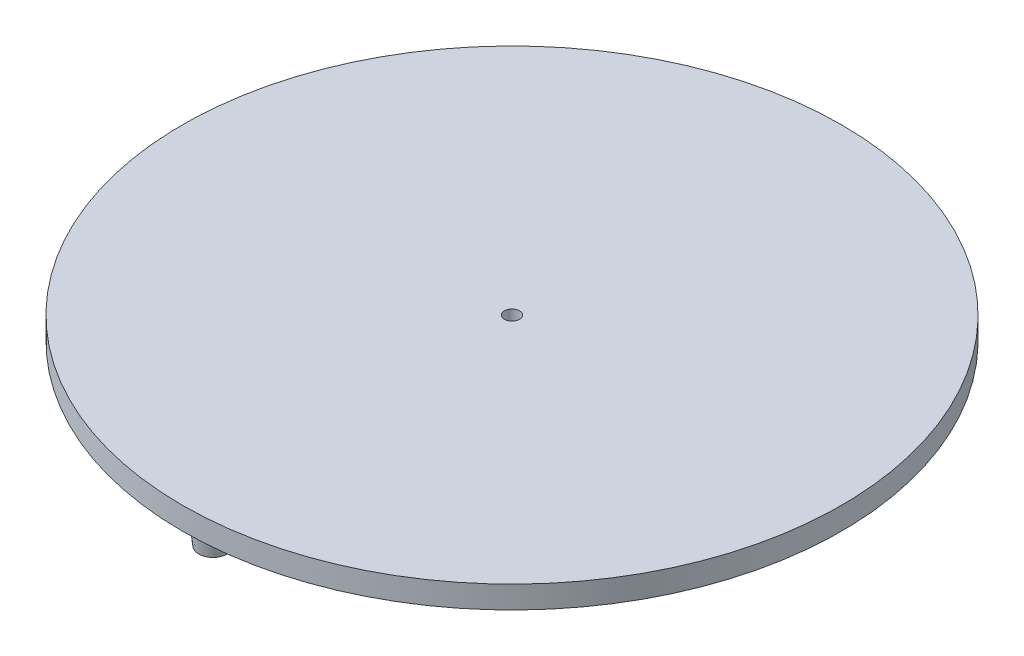
ISO-10303-21;
HEADER;
FILE_DESCRIPTION(('STEP AP214'),'2;1');
FILE_NAME('part.step','',(''),(''),'','','');
FILE_SCHEMA(('AUTOMOTIVE_DESIGN { 1 0 10303 214 1 1 1 1 }'));
ENDSEC;
DATA;
#1=APPLICATION_CONTEXT('core data for automotive mechanical design processes');
#2=APPLICATION_PROTOCOL_DEFINITION('international standard','automotive_design',2000,#1);
#3=PRODUCT_CONTEXT('',#1,'mechanical');
#4=PRODUCT('Part','Part','',(#3));
#5=PRODUCT_RELATED_PRODUCT_CATEGORY('part','',(#4));
#6=PRODUCT_DEFINITION_FORMATION('','',#4);
#7=PRODUCT_DEFINITION_CONTEXT('part definition',#1,'design');
#8=PRODUCT_DEFINITION('design','',#6,#7);
#9=PRODUCT_DEFINITION_SHAPE('','',#8);
#10=(LENGTH_UNIT() NAMED_UNIT(*) SI_UNIT(.MILLI.,.METRE.));
#11=(NAMED_UNIT(*) PLANE_ANGLE_UNIT() SI_UNIT($,.RADIAN.));
#12=(NAMED_UNIT(*) SI_UNIT($,.STERADIAN.) SOLID_ANGLE_UNIT());
#13=UNCERTAINTY_MEASURE_WITH_UNIT(LENGTH_MEASURE(1.E-05),#10,'distance_accuracy_value','');
#14=(GEOMETRIC_REPRESENTATION_CONTEXT(3) GLOBAL_UNCERTAINTY_ASSIGNED_CONTEXT((#13)) GLOBAL_UNIT_ASSIGNED_CONTEXT((#10,
#11,#12)) REPRESENTATION_CONTEXT('',''));
#15=CARTESIAN_POINT('',(0.,0.,0.));
#16=DIRECTION('',(0.,0.,1.));
#17=DIRECTION('',(1.,0.,0.));
#18=AXIS2_PLACEMENT_3D('',#15,#16,#17);
#19=CARTESIAN_POINT('',(0.,19.05,0.));
#20=DIRECTION('',(0.,-1.,0.));
#21=DIRECTION('',(0.,0.,-1.));
#22=AXIS2_PLACEMENT_3D('',#19,#20,#21);
#23=CYLINDRICAL_SURFACE('',#22,279.945595429);
#24=CARTESIAN_POINT('',(0.,19.05,0.));
#25=DIRECTION('',(0.,1.,0.));
#26=DIRECTION('',(0.,0.,1.));
#27=AXIS2_PLACEMENT_3D('',#24,#25,#26);
#28=CIRCLE('',#27,279.945595429);
#29=CARTESIAN_POINT('',(0.,19.05,-279.945595429));
#30=VERTEX_POINT('',#29);
#31=EDGE_CURVE('E11',#30,#30,#28,.T.);
#32=CARTESIAN_POINT('',(0.,0.,0.));
#33=DIRECTION('',(0.,1.,0.));
#34=DIRECTION('',(0.,0.,1.));
#35=AXIS2_PLACEMENT_3D('',#32,#33,#34);
#36=CIRCLE('',#35,279.945595429);
#37=CARTESIAN_POINT('',(0.,0.,-279.945595429));
#38=VERTEX_POINT('',#37);
#39=EDGE_CURVE('E79',#38,#38,#36,.T.);
#40=CARTESIAN_POINT('',(0.,19.05,-279.945595429));
#41=CARTESIAN_POINT('',(0.,18.8515625,-279.945595429));
#42=CARTESIAN_POINT('',(0.,18.653125,-279.945595429));
#43=CARTESIAN_POINT('',(0.,18.25625,-279.945595429));
#44=CARTESIAN_POINT('',(0.,18.0578125,-279.945595429));
#45=CARTESIAN_POINT('',(0.,17.6609375,-279.945595429));
#46=CARTESIAN_POINT('',(0.,17.4625,-279.945595429));
#47=CARTESIAN_POINT('',(0.,17.065625,-279.945595429));
#48=CARTESIAN_POINT('',(0.,16.8671875,-279.945595429));
#49=CARTESIAN_POINT('',(0.,16.4703125,-279.945595429));
#50=CARTESIAN_POINT('',(0.,16.271875,-279.945595429));
#51=CARTESIAN_POINT('',(0.,15.875,-279.945595429));
#52=CARTESIAN_POINT('',(0.,15.6765625,-279.945595429));
#53=CARTESIAN_POINT('',(0.,15.2796875,-279.945595429));
#54=CARTESIAN_POINT('',(0.,15.08125,-279.945595429));
#55=CARTESIAN_POINT('',(0.,14.684375,-279.945595429));
#56=CARTESIAN_POINT('',(0.,14.4859375,-279.945595429));
#57=CARTESIAN_POINT('',(0.,14.0890625,-279.945595429));
#58=CARTESIAN_POINT('',(0.,13.890625,-279.945595429));
#59=CARTESIAN_POINT('',(0.,13.49375,-279.945595429));
#60=CARTESIAN_POINT('',(0.,13.2953125,-279.945595429));
#61=CARTESIAN_POINT('',(0.,12.8984375,-279.945595429));
#62=CARTESIAN_POINT('',(0.,12.7,-279.945595429));
#63=CARTESIAN_POINT('',(0.,12.303125,-279.945595429));
#64=CARTESIAN_POINT('',(0.,12.1046875,-279.945595429));
#65=CARTESIAN_POINT('',(0.,11.7078125,-279.945595429));
#66=CARTESIAN_POINT('',(0.,11.509375,-279.945595429));
#67=CARTESIAN_POINT('',(0.,11.1125,-279.945595429));
#68=CARTESIAN_POINT('',(0.,10.9140625,-279.945595429));
#69=CARTESIAN_POINT('',(0.,10.5171875,-279.945595429));
#70=CARTESIAN_POINT('',(0.,10.31875,-279.945595429));
#71=CARTESIAN_POINT('',(0.,9.921875,-279.945595429));
#72=CARTESIAN_POINT('',(0.,9.7234375,-279.945595429));
#73=CARTESIAN_POINT('',(0.,9.3265625,-279.945595429));
#74=CARTESIAN_POINT('',(0.,9.128125,-279.945595429));
#75=CARTESIAN_POINT('',(0.,8.73125,-279.945595429));
#76=CARTESIAN_POINT('',(0.,8.5328125,-279.945595429));
#77=CARTESIAN_POINT('',(0.,8.1359375,-279.945595429));
#78=CARTESIAN_POINT('',(0.,7.9375,-279.945595429));
#79=CARTESIAN_POINT('',(0.,7.540625,-279.945595429));
#80=CARTESIAN_POINT('',(0.,7.3421875,-279.945595429));
#81=CARTESIAN_POINT('',(0.,6.9453125,-279.945595429));
#82=CARTESIAN_POINT('',(0.,6.746875,-279.945595429));
#83=CARTESIAN_POINT('',(0.,6.35,-279.945595429));
#84=CARTESIAN_POINT('',(0.,6.1515625,-279.945595429));
#85=CARTESIAN_POINT('',(0.,5.7546875,-279.945595429));
#86=CARTESIAN_POINT('',(0.,5.55625,-279.945595429));
#87=CARTESIAN_POINT('',(0.,5.159375,-279.945595429));
#88=CARTESIAN_POINT('',(0.,4.9609375,-279.945595429));
#89=CARTESIAN_POINT('',(0.,4.5640625,-279.945595429));
#90=CARTESIAN_POINT('',(0.,4.365625,-279.945595429));
#91=CARTESIAN_POINT('',(0.,3.96875,-279.945595429));
#92=CARTESIAN_POINT('',(0.,3.7703125,-279.945595429));
#93=CARTESIAN_POINT('',(0.,3.3734375,-279.945595429));
#94=CARTESIAN_POINT('',(0.,3.175,-279.945595429));
#95=CARTESIAN_POINT('',(0.,2.778125,-279.945595429));
#96=CARTESIAN_POINT('',(0.,2.5796875,-279.945595429));
#97=CARTESIAN_POINT('',(0.,2.1828125,-279.945595429));
#98=CARTESIAN_POINT('',(0.,1.984375,-279.945595429));
#99=CARTESIAN_POINT('',(0.,1.5875,-279.945595429));
#100=CARTESIAN_POINT('',(0.,1.3890625,-279.945595429));
#101=CARTESIAN_POINT('',(0.,0.992187500000001,-279.945595429));
#102=CARTESIAN_POINT('',(0.,0.793750000000001,-279.945595429));
#103=CARTESIAN_POINT('',(0.,0.396875,-279.945595429));
#104=CARTESIAN_POINT('',(0.,0.1984375,-279.945595429));
#105=CARTESIAN_POINT('',(0.,0.,-279.945595429));
#106=B_SPLINE_CURVE_WITH_KNOTS('',3,(#40,#41,#42,#43,#44,#45,#46,#47,#48,#49,#50,#51,#52,#53,
#54,#55,#56,#57,#58,#59,#60,#61,#62,#63,#64,#65,#66,#67,#68,#69,#70,#71,#72,#73,#74,#75,#76,#77,
#78,#79,#80,#81,#82,#83,#84,#85,#86,#87,#88,#89,#90,#91,#92,#93,#94,#95,#96,#97,#98,#99,#100,
#101,#102,#103,#104,#105),.UNSPECIFIED.,.F.,.F.,(4,2,2,2,2,2,2,2,2,2,2,2,2,2,2,2,2,2,2,2,2,2,2,
2,2,2,2,2,2,2,2,2,4),(0.,0.5953125,1.190625,1.7859375,2.38125,2.9765625,3.571875,4.1671875,
4.7625,5.3578125,5.953125,6.5484375,7.14375,7.7390625,8.334375,8.9296875,9.525,10.1203125,
10.715625,11.3109375,11.90625,12.5015625,13.096875,13.6921875,14.2875,14.8828125,15.478125,
16.0734375,16.66875,17.2640625,17.859375,18.4546875,19.05),.UNSPECIFIED.);
#107=EDGE_CURVE('BSEAM68',#30,#38,#106,.T.);
#108=ORIENTED_EDGE('',*,*,#31,.F.);
#109=ORIENTED_EDGE('',*,*,#39,.T.);
#110=ORIENTED_EDGE('',*,*,#107,.T.);
#111=ORIENTED_EDGE('',*,*,#107,.F.);
#112=EDGE_LOOP('',(#108,#110,#109,#111));
#113=FACE_BOUND('',#112,.T.);
#114=ADVANCED_FACE('F68',(#113),#23,.T.);
#115=CARTESIAN_POINT('',(0.,19.05,0.));
#116=DIRECTION('',(0.,1.,0.));
#117=DIRECTION('',(0.,0.,1.));
#118=AXIS2_PLACEMENT_3D('',#115,#116,#117);
#119=PLANE('',#118);
#120=CARTESIAN_POINT('',(0.,19.05,0.));
#121=DIRECTION('',(0.,1.,0.));
#122=DIRECTION('',(0.,0.,1.));
#123=AXIS2_PLACEMENT_3D('',#120,#121,#122);
#124=CIRCLE('',#123,6.35);
#125=CARTESIAN_POINT('',(0.,19.05,6.35));
#126=VERTEX_POINT('',#125);
#127=EDGE_CURVE('E88',#126,#126,#124,.T.);
#128=ORIENTED_EDGE('',*,*,#127,.F.);
#129=EDGE_LOOP('',(#128));
#130=FACE_BOUND('',#129,.T.);
#131=ORIENTED_EDGE('',*,*,#31,.T.);
#132=EDGE_LOOP('',(#131));
#133=FACE_BOUND('',#132,.T.);
#134=ADVANCED_FACE('F120',(#130,#133),#119,.T.);
#135=CARTESIAN_POINT('',(0.,0.,0.));
#136=DIRECTION('',(0.,1.,0.));
#137=DIRECTION('',(0.,0.,1.));
#138=AXIS2_PLACEMENT_3D('',#135,#136,#137);
#139=PLANE('',#138);
#140=CARTESIAN_POINT('',(-219.970452561249,0.,-126.999999999998));
#141=DIRECTION('',(0.,-1.,0.));
#142=DIRECTION('',(0.,0.,-1.));
#143=AXIS2_PLACEMENT_3D('',#140,#141,#142);
#144=CIRCLE('',#143,14.225);
#145=CARTESIAN_POINT('',(-219.970452561249,0.,-141.224999999998));
#146=VERTEX_POINT('',#145);
#147=EDGE_CURVE('E207',#146,#146,#144,.T.);
#148=ORIENTED_EDGE('',*,*,#147,.F.);
#149=EDGE_LOOP('',(#148));
#150=FACE_BOUND('',#149,.T.);
#151=CARTESIAN_POINT('',(219.970452561247,0.,-127.000000000001));
#152=DIRECTION('',(0.,-1.,0.));
#153=DIRECTION('',(0.,0.,-1.));
#154=AXIS2_PLACEMENT_3D('',#151,#152,#153);
#155=CIRCLE('',#154,14.225);
#156=CARTESIAN_POINT('',(219.970452561247,0.,-141.225000000001));
#157=VERTEX_POINT('',#156);
#158=EDGE_CURVE('E255',#157,#157,#155,.T.);
#159=ORIENTED_EDGE('',*,*,#158,.F.);
#160=EDGE_LOOP('',(#159));
#161=FACE_BOUND('',#160,.T.);
#162=CARTESIAN_POINT('',(14.1957535473107,0.,253.088294880997));
#163=CARTESIAN_POINT('',(14.1701984288474,0.,252.69032014969));
#164=CARTESIAN_POINT('',(14.1282108687022,0.,252.293449179886));
#165=CARTESIAN_POINT('',(14.0111655203681,0.,251.504486149537));
#166=CARTESIAN_POINT('',(13.9361007012605,0.,251.112395123238));
#167=CARTESIAN_POINT('',(13.7530641359136,0.,250.335636393652));
#168=CARTESIAN_POINT('',(13.64506571301,0.,249.950974978035));
#169=CARTESIAN_POINT('',(13.3968470480072,0.,249.192209699102));
#170=CARTESIAN_POINT('',(13.2566283591753,0.,248.818105327831));
#171=CARTESIAN_POINT('',(12.9450238920503,0.,248.083222366163));
#172=CARTESIAN_POINT('',(12.7736458744879,0.,247.722440484446));
#173=CARTESIAN_POINT('',(12.4010127280601,0.,247.016646773546));
#174=CARTESIAN_POINT('',(12.199757088719,0.,246.67163521394));
#175=CARTESIAN_POINT('',(11.7689167748453,0.,245.999769622604));
#176=CARTESIAN_POINT('',(11.5393312927843,0.,245.672916108846));
#177=CARTESIAN_POINT('',(11.053570361634,0.,245.039608469317));
#178=CARTESIAN_POINT('',(10.7973949020217,0.,244.733154351619));
#179=CARTESIAN_POINT('',(10.2601852904625,0.,244.142566598594));
#180=CARTESIAN_POINT('',(9.97913765783475,0.,243.858445227049));
#181=CARTESIAN_POINT('',(9.39430449709158,0.,243.314657207116));
#182=CARTESIAN_POINT('',(9.09051895078833,0.,243.054990578289));
#183=CARTESIAN_POINT('',(8.46234491718254,0.,242.561949763203));
#184=CARTESIAN_POINT('',(8.13795786151846,0.,242.328573753078));
#185=CARTESIAN_POINT('',(7.47079218439578,0.,241.889786180899));
#186=CARTESIAN_POINT('',(7.12801366421285,0.,241.684374464877));
#187=CARTESIAN_POINT('',(6.42361584271373,0.,241.301541003989));
#188=CARTESIAN_POINT('',(6.06186818895044,0.,241.124355305387));
#189=CARTESIAN_POINT('',(5.3246131376312,0.,240.801372266642));
#190=CARTESIAN_POINT('',(4.94910558413116,0.,240.655575282363));
#191=CARTESIAN_POINT('',(4.18702989600398,0.,240.396556873866));
#192=CARTESIAN_POINT('',(3.80046211416906,0.,240.283334411877));
#193=CARTESIAN_POINT('',(3.01907021512381,0.,240.090359506911));
#194=CARTESIAN_POINT('',(2.62424640108217,0.,240.010605837187));
#195=CARTESIAN_POINT('',(1.83392127625669,0.,239.885849196171));
#196=CARTESIAN_POINT('',(1.43848242546301,0.,239.840448951355));
#197=CARTESIAN_POINT('',(0.645130012448755,0.,239.783009581897));
#198=CARTESIAN_POINT('',(0.247216352177549,0.,239.770971787605));
#199=CARTESIAN_POINT('',(-0.349291218450164,0.,239.777726350679));
#200=CARTESIAN_POINT('',(-0.54809998685375,0.,239.784116242565));
#201=CARTESIAN_POINT('',(-0.945286427834851,0.,239.805070325903));
#202=CARTESIAN_POINT('',(-1.14366409955519,0.,239.819634533593));
#203=CARTESIAN_POINT('',(-1.73761890471403,0.,239.87562433426));
#204=CARTESIAN_POINT('',(-2.13211040367793,0.,239.929348153872));
#205=CARTESIAN_POINT('',(-2.91944417468338,0.,240.070421685702));
#206=CARTESIAN_POINT('',(-3.31222144347612,0.,240.158132034514));
#207=CARTESIAN_POINT('',(-4.08888303565812,0.,240.366722542631));
#208=CARTESIAN_POINT('',(-4.47276737834824,0.,240.487602629939));
#209=CARTESIAN_POINT('',(-5.22870733822446,0.,240.761683855311));
#210=CARTESIAN_POINT('',(-5.60076587700726,0.,240.914876937814));
#211=CARTESIAN_POINT('',(-6.33046170708994,0.,241.252440065897));
#212=CARTESIAN_POINT('',(-6.68809893222865,0.,241.436810254489));
#213=CARTESIAN_POINT('',(-7.38233581365691,0.,241.832959270787));
#214=CARTESIAN_POINT('',(-7.71913188451525,0.,242.044394098169));
#215=CARTESIAN_POINT('',(-8.37384784549451,0.,242.49469669585));
#216=CARTESIAN_POINT('',(-8.69176793420417,0.,242.73356417746));
#217=CARTESIAN_POINT('',(-9.30667989876059,0.,243.237037849946));
#218=CARTESIAN_POINT('',(-9.60366563926392,0.,243.501651532763));
#219=CARTESIAN_POINT('',(-10.1746051113361,0.,244.054659725459));
#220=CARTESIAN_POINT('',(-10.4485586113721,0.,244.343054474343));
#221=CARTESIAN_POINT('',(-10.9740658262415,0.,244.944480371347));
#222=CARTESIAN_POINT('',(-11.2253796511023,0.,245.257721177234));
#223=CARTESIAN_POINT('',(-11.7008189327973,0.,245.90420036059));
#224=CARTESIAN_POINT('',(-11.9249443127452,0.,246.237438794606));
#225=CARTESIAN_POINT('',(-12.3442849556832,0.,246.92151214586));
#226=CARTESIAN_POINT('',(-12.5395081656094,0.,247.272342190461));
#227=CARTESIAN_POINT('',(-12.8996109690582,0.,247.989247967696));
#228=CARTESIAN_POINT('',(-13.0644905856622,0.,248.355323688733));
#229=CARTESIAN_POINT('',(-13.3626376356565,0.,249.100263990521));
#230=CARTESIAN_POINT('',(-13.4958953762573,0.,249.479132451978));
#231=CARTESIAN_POINT('',(-13.7296610518645,0.,250.246839586769));
#232=CARTESIAN_POINT('',(-13.8301692739105,0.,250.635678172684));
#233=CARTESIAN_POINT('',(-13.9976876450379,0.,251.42059988889));
#234=CARTESIAN_POINT('',(-14.0646902124476,0.,251.816684637845));
#235=CARTESIAN_POINT('',(-14.1647653564846,0.,252.613106056329));
#236=CARTESIAN_POINT('',(-14.1978375649059,0.,253.013442771953));
#237=CARTESIAN_POINT('',(-14.2298872687194,0.,253.811517386029));
#238=CARTESIAN_POINT('',(-14.2292011184116,0.,254.209241446331));
#239=CARTESIAN_POINT('',(-14.2036041117617,0.,254.804670820507));
#240=CARTESIAN_POINT('',(-14.1909744719727,0.,255.002975710558));
#241=CARTESIAN_POINT('',(-14.1575622461974,0.,255.398896622413));
#242=CARTESIAN_POINT('',(-14.1367795160422,0.,255.596512631974));
#243=CARTESIAN_POINT('',(-14.0621226448776,0.,256.187766776277));
#244=CARTESIAN_POINT('',(-13.9959337983078,0.,256.579952808046));
#245=CARTESIAN_POINT('',(-13.8721825800341,0.,257.1628503049));
#246=CARTESIAN_POINT('',(-13.8268525449697,0.,257.356257970723));
#247=CARTESIAN_POINT('',(-13.7280780188843,0.,257.741047887677));
#248=CARTESIAN_POINT('',(-13.6746314276547,0.,257.932429600832));
#249=CARTESIAN_POINT('',(-13.5008856686508,0.,258.507402234307));
#250=CARTESIAN_POINT('',(-13.3681353068383,0.,258.887310467469));
#251=CARTESIAN_POINT('',(-13.0706869141436,0.,259.634357344851));
#252=CARTESIAN_POINT('',(-12.9059882086268,0.,260.001495719224));
#253=CARTESIAN_POINT('',(-12.5458946917486,0.,260.72043105385));
#254=CARTESIAN_POINT('',(-12.3504984061437,0.,261.072227276263));
#255=CARTESIAN_POINT('',(-11.93055407202,0.,261.757953187321));
#256=CARTESIAN_POINT('',(-11.7060063955882,0.,262.091883103935));
#257=CARTESIAN_POINT('',(-11.2321062892185,0.,262.736009124996));
#258=CARTESIAN_POINT('',(-10.9830529698637,0.,263.046425392992));
#259=CARTESIAN_POINT('',(-10.4598385016364,0.,263.645554053867));
#260=CARTESIAN_POINT('',(-10.1856667112733,0.,263.934257152721));
#261=CARTESIAN_POINT('',(-9.61422174113692,0.,264.487887795126));
#262=CARTESIAN_POINT('',(-9.316945718994,0.,264.752812404689));
#263=CARTESIAN_POINT('',(-8.70152159980922,0.,265.256902827729));
#264=CARTESIAN_POINT('',(-8.38338273145313,0.,265.496079908592));
#265=CARTESIAN_POINT('',(-7.72435586822739,0.,265.94981139845));
#266=CARTESIAN_POINT('',(-7.38324087626948,0.,266.16403625624));
#267=CARTESIAN_POINT('',(-6.68411224766656,0.,266.562874204898));
#268=CARTESIAN_POINT('',(-6.32609850594502,0.,266.747487111607));
#269=CARTESIAN_POINT('',(-5.59577675381521,0.,267.085603337007));
#270=CARTESIAN_POINT('',(-5.22347241117856,0.,267.239114575468));
#271=CARTESIAN_POINT('',(-4.46713410431456,0.,267.513844900525));
#272=CARTESIAN_POINT('',(-4.08310026684144,0.,267.635064335944));
#273=CARTESIAN_POINT('',(-3.3090094639382,0.,267.843452398562));
#274=CARTESIAN_POINT('',(-2.9190197450461,0.,267.930870875196));
#275=CARTESIAN_POINT('',(-2.13304130739261,0.,268.072320795742));
#276=CARTESIAN_POINT('',(-1.73705271433103,0.,268.12635293824));
#277=CARTESIAN_POINT('',(-0.941810124613052,0.,268.200788460301));
#278=CARTESIAN_POINT('',(-0.542555158229486,0.,268.221181459833));
#279=CARTESIAN_POINT('',(0.256263702146352,0.,268.228509781742));
#280=CARTESIAN_POINT('',(0.655827608704899,0.,268.215443662889));
#281=CARTESIAN_POINT('',(1.4529246839055,0.,268.156323749124));
#282=CARTESIAN_POINT('',(1.85045533553452,0.,268.110235973957));
#283=CARTESIAN_POINT('',(2.64022766168315,0.,267.984814645269));
#284=CARTESIAN_POINT('',(3.03246965693371,0.,267.905483117264));
#285=CARTESIAN_POINT('',(3.80870589791642,0.,267.713922992138));
#286=CARTESIAN_POINT('',(4.19270276439268,0.,267.601705019335));
#287=CARTESIAN_POINT('',(4.94979011535204,0.,267.345062671961));
#288=CARTESIAN_POINT('',(5.32288035634737,0.,267.200637578994));
#289=CARTESIAN_POINT('',(6.05502469267624,0.,266.880837512831));
#290=CARTESIAN_POINT('',(6.41409482140605,0.,266.705499238367));
#291=CARTESIAN_POINT('',(7.11613030196536,0.,266.325108798715));
#292=CARTESIAN_POINT('',(7.45909567836101,0.,266.120056678855));
#293=CARTESIAN_POINT('',(8.12662546442288,0.,265.6817686154));
#294=CARTESIAN_POINT('',(8.45118566626105,0.,265.44852626476));
#295=CARTESIAN_POINT('',(9.07960627430473,0.,264.955651908386));
#296=CARTESIAN_POINT('',(9.38346659272219,0.,264.696019790746));
#297=CARTESIAN_POINT('',(9.96849011327641,0.,264.152197748035));
#298=CARTESIAN_POINT('',(10.249647725707,0.,263.868001810472));
#299=CARTESIAN_POINT('',(10.7872552863863,0.,263.277118123827));
#300=CARTESIAN_POINT('',(11.0437046620916,0.,262.970429853838));
#301=CARTESIAN_POINT('',(11.5301232662198,0.,262.336643890258));
#302=CARTESIAN_POINT('',(11.7600880582045,0.,262.009542791417));
#303=CARTESIAN_POINT('',(12.1918083210514,0.,261.337229609491));
#304=CARTESIAN_POINT('',(12.3935641307733,0.,260.99201774403));
#305=CARTESIAN_POINT('',(12.768817431463,0.,260.283058718325));
#306=CARTESIAN_POINT('',(12.9420791782698,0.,259.919186710592));
#307=CARTESIAN_POINT('',(13.2570079972181,0.,259.178027889109));
#308=CARTESIAN_POINT('',(13.3986759316686,0.,258.800741441814));
#309=CARTESIAN_POINT('',(13.6491290442035,0.,258.035883015048));
#310=CARTESIAN_POINT('',(13.7579521842066,0.,257.648323477403));
#311=CARTESIAN_POINT('',(13.9420590511496,0.,256.865453810749));
#312=CARTESIAN_POINT('',(14.0173518306857,0.,256.470145803815));
#313=CARTESIAN_POINT('',(14.1479273763221,0.,255.579004153764));
#314=CARTESIAN_POINT('',(14.1940751043002,0.,255.081807380599));
#315=CARTESIAN_POINT('',(14.233969510406,0.,254.085263702902));
#316=CARTESIAN_POINT('',(14.2277072797338,0.,253.585916447245));
#317=CARTESIAN_POINT('',(14.1957535473107,0.,253.088294880997));
#318=B_SPLINE_CURVE_WITH_KNOTS('',3,(#162,#163,#164,#165,#166,#167,#168,#169,#170,#171,#172,
#173,#174,#175,#176,#177,#178,#179,#180,#181,#182,#183,#184,#185,#186,#187,#188,#189,#190,#191,
#192,#193,#194,#195,#196,#197,#198,#199,#200,#201,#202,#203,#204,#205,#206,#207,#208,#209,#210,
#211,#212,#213,#214,#215,#216,#217,#218,#219,#220,#221,#222,#223,#224,#225,#226,#227,#228,#229,
#230,#231,#232,#233,#234,#235,#236,#237,#238,#239,#240,#241,#242,#243,#244,#245,#246,#247,#248,
#249,#250,#251,#252,#253,#254,#255,#256,#257,#258,#259,#260,#261,#262,#263,#264,#265,#266,#267,
#268,#269,#270,#271,#272,#273,#274,#275,#276,#277,#278,#279,#280,#281,#282,#283,#284,#285,#286,
#287,#288,#289,#290,#291,#292,#293,#294,#295,#296,#297,#298,#299,#300,#301,#302,#303,#304,#305,
#306,#307,#308,#309,#310,#311,#312,#313,#314,#315,#316,#317),.UNSPECIFIED.,.T.,.F.,(4,2,2,2,2,2,
2,2,2,2,2,2,2,2,2,2,2,2,2,2,2,2,2,2,2,2,2,2,2,2,2,2,2,2,2,2,2,2,2,2,2,2,2,2,2,2,2,2,2,2,2,2,2,2,
2,2,2,2,2,2,2,2,2,2,2,2,2,2,2,2,2,2,2,2,2,2,2,4),(0.,1.19594747775145,2.39214928941269,
3.5893226261229,4.78643826187266,5.98325614419806,7.18009447717769,8.37696693333595,
9.57383986315832,10.7713655164573,11.9688921276529,13.1663356112893,14.3637725016794,
15.5707498331895,16.7777408478839,17.9846934055668,19.1916017204647,20.3843301912832,
21.5771062222822,22.1736948982859,22.7702847594458,23.9631875913309,25.1691113429508,
26.3750324770358,27.5806533320691,28.7862797175431,29.9778732386086,31.1694542210426,
32.3613829869982,33.5533237334526,34.7566900645,35.9600597984683,37.1630980370947,
38.3661353606088,39.5695409661496,40.7729360239247,41.976603263296,43.1802835645091,
44.371973346072,44.9679461584605,45.5639295097456,46.7554717399176,47.3512767538425,
47.9472361994797,49.1529404500124,50.3586701634718,51.5644577995,52.7702300464182,
53.9627757761049,55.1558290873082,56.3490294054683,57.5417054257465,58.748679323332,
59.9556607268771,61.1623343957482,62.3689950293691,63.5665575219771,64.7640949555955,
65.9620018442941,67.1599603329079,68.3591533297513,69.5582732713418,70.7570062506903,
71.9557659710567,73.1531120447117,74.3504562918791,75.5480731837586,76.7456951544065,
77.9436111019527,79.1415548011403,80.3396988771599,81.5378285592726,82.7454201076858,
83.9529786925345,85.159136192278,86.3649678534102,87.8601082819939,89.355502864139),.UNSPECIFIED.);
#319=CARTESIAN_POINT('',(-14.1957535473107,0.,254.911705119003));
#320=VERTEX_POINT('',#319);
#321=EDGE_CURVE('E70',#320,#320,#318,.F.);
#322=ORIENTED_EDGE('',*,*,#321,.F.);
#323=EDGE_LOOP('',(#322));
#324=FACE_BOUND('',#323,.T.);
#325=CARTESIAN_POINT('',(0.,0.,0.));
#326=DIRECTION('',(0.,1.,0.));
#327=DIRECTION('',(0.,0.,1.));
#328=AXIS2_PLACEMENT_3D('',#325,#326,#327);
#329=CIRCLE('',#328,6.35);
#330=CARTESIAN_POINT('',(0.,0.,6.35));
#331=VERTEX_POINT('',#330);
#332=EDGE_CURVE('E84',#331,#331,#329,.F.);
#333=ORIENTED_EDGE('',*,*,#332,.F.);
#334=EDGE_LOOP('',(#333));
#335=FACE_BOUND('',#334,.T.);
#336=ORIENTED_EDGE('',*,*,#39,.F.);
#337=EDGE_LOOP('',(#336));
#338=FACE_BOUND('',#337,.T.);
#339=ADVANCED_FACE('F119',(#150,#161,#324,#335,#338),#139,.F.);
#340=CARTESIAN_POINT('',(0.,-0.001000000000001,0.));
#341=DIRECTION('',(0.,1.,0.));
#342=DIRECTION('',(0.,0.,1.));
#343=AXIS2_PLACEMENT_3D('',#340,#341,#342);
#344=CYLINDRICAL_SURFACE('',#343,6.35);
#345=ORIENTED_EDGE('',*,*,#127,.T.);
#346=EDGE_LOOP('',(#345));
#347=FACE_BOUND('',#346,.T.);
#348=ORIENTED_EDGE('',*,*,#332,.T.);
#349=EDGE_LOOP('',(#348));
#350=FACE_BOUND('',#349,.T.);
#351=ADVANCED_FACE('F108',(#347,#350),#344,.F.);
#352=CARTESIAN_POINT('',(0.,-23.749999998,254.));
#353=DIRECTION('',(0.,-1.,0.));
#354=DIRECTION('',(0.,0.,-1.));
#355=AXIS2_PLACEMENT_3D('',#352,#353,#354);
#356=PLANE('',#355);
#357=CARTESIAN_POINT('',(0.,-23.749999998,254.));
#358=DIRECTION('',(0.,-1.,0.));
#359=DIRECTION('',(0.,0.,-1.));
#360=AXIS2_PLACEMENT_3D('',#357,#358,#359);
#361=CIRCLE('',#360,12.075);
#362=CARTESIAN_POINT('',(-12.0303234025491,-23.749999998,255.037759042399));
#363=VERTEX_POINT('',#362);
#364=EDGE_CURVE('E90',#363,#363,#361,.T.);
#365=ORIENTED_EDGE('',*,*,#364,.T.);
#366=EDGE_LOOP('',(#365));
#367=FACE_BOUND('',#366,.T.);
#368=ADVANCED_FACE('F97',(#367),#356,.T.);
#369=CARTESIAN_POINT('',(-14.1957535473107,0.,254.911705119003));
#370=CARTESIAN_POINT('',(-14.1957535473107,-7.94961548482026,254.911705119003));
#371=CARTESIAN_POINT('',(-13.1130384749299,-15.8498077414101,254.974732080701));
#372=CARTESIAN_POINT('',(-12.0303234025491,-23.749999998,255.037759042399));
#373=CARTESIAN_POINT('',(-14.2209127343008,0.,254.519962646006));
#374=CARTESIAN_POINT('',(-14.2209127343008,-7.94961548482026,254.519962646006));
#375=CARTESIAN_POINT('',(-13.1399369382295,-15.8498077414101,254.6128679427));
#376=CARTESIAN_POINT('',(-12.0589611421582,-23.749999998,254.705773239394));
#377=CARTESIAN_POINT('',(-14.238953276041,0.,253.74180481998));
#378=CARTESIAN_POINT('',(-14.238953276041,-7.94961830068837,253.74180481998));
#379=CARTESIAN_POINT('',(-13.1638490539977,-15.8498091493442,253.893763487851));
#380=CARTESIAN_POINT('',(-12.0887448319545,-23.749999998,254.045722155722));
#381=CARTESIAN_POINT('',(-14.1726104167038,0.,252.594450054141));
#382=CARTESIAN_POINT('',(-14.1726104167038,-7.94962420106348,252.594450054141));
#383=CARTESIAN_POINT('',(-13.1131967993869,-15.8498120995317,252.832615607808));
#384=CARTESIAN_POINT('',(-12.0537831820699,-23.749999998,253.070781161474));
#385=CARTESIAN_POINT('',(-14.0162937101912,0.,251.470877874802));
#386=CARTESIAN_POINT('',(-14.0162937101912,-7.94962837982032,251.470877874802));
#387=CARTESIAN_POINT('',(-12.9791581207426,-15.8498141889102,251.79261386877));
#388=CARTESIAN_POINT('',(-11.9420225312939,-23.749999998,252.114349862738));
#389=CARTESIAN_POINT('',(-12.5591293366966,0.,244.895543997572));
#390=CARTESIAN_POINT('',(-12.5591293366966,-7.94962721536289,244.895543997573));
#391=CARTESIAN_POINT('',(-11.6934115300551,-15.8498136066814,245.701304313228));
#392=CARTESIAN_POINT('',(-10.8276937234136,-23.749999998,246.507064628884));
#393=CARTESIAN_POINT('',(-7.17958468694651,0.,240.20679344453));
#394=CARTESIAN_POINT('',(-7.17958468694651,-7.94961860257245,240.20679344453));
#395=CARTESIAN_POINT('',(-6.76455828871114,-15.8498093002862,241.317336937864));
#396=CARTESIAN_POINT('',(-6.34953189047577,-23.749999998,242.427880431198));
#397=CARTESIAN_POINT('',(6.92314434092724,0.,239.301062712888));
#398=CARTESIAN_POINT('',(6.92314434092724,-7.94961158763001,239.301062712888));
#399=CARTESIAN_POINT('',(6.2625506793121,-15.849805792815,240.348992259078));
#400=CARTESIAN_POINT('',(5.60195701769696,-23.749999998,241.396921805268));
#401=CARTESIAN_POINT('',(13.6925698075094,0.,245.253445421068));
#402=CARTESIAN_POINT('',(13.6925698075094,-7.94961548482025,245.253445421068));
#403=CARTESIAN_POINT('',(12.5750692089375,-15.8498077414101,245.787985159286));
#404=CARTESIAN_POINT('',(11.4575686103656,-23.749999998,246.322524897505));
#405=CARTESIAN_POINT('',(14.698937287112,0.,260.923144340927));
#406=CARTESIAN_POINT('',(14.698937287112,-7.94961548482026,260.923144340927));
#407=CARTESIAN_POINT('',(13.6510077409222,-15.8498077414101,260.262550679312));
#408=CARTESIAN_POINT('',(12.6030781947325,-23.749999998,259.601957017697));
#409=CARTESIAN_POINT('',(8.74655457893248,0.,267.692569807509));
#410=CARTESIAN_POINT('',(8.74655457893248,-7.94961158763002,267.692569807509));
#411=CARTESIAN_POINT('',(8.21201484071372,-15.849805792815,266.575069208938));
#412=CARTESIAN_POINT('',(7.67747510249496,-23.749999998,265.457568610366));
#413=CARTESIAN_POINT('',(-5.35617444894127,0.,268.598300539152));
#414=CARTESIAN_POINT('',(-5.35617444894127,-7.94961860257245,268.598300539152));
#415=CARTESIAN_POINT('',(-4.81509412730952,-15.8498093002862,267.543413887724));
#416=CARTESIAN_POINT('',(-4.27401380567776,-23.749999998,266.488527236296));
#417=CARTESIAN_POINT('',(-11.2913081744052,0.,264.636221533356));
#418=CARTESIAN_POINT('',(-11.2913081744052,-7.94962721536288,264.636221533356));
#419=CARTESIAN_POINT('',(-10.337944796657,-15.8498136066814,263.936353490801));
#420=CARTESIAN_POINT('',(-9.38458141890877,-23.749999998,263.236485448245));
#421=CARTESIAN_POINT('',(-13.5776176053597,0.,258.301307738019));
#422=CARTESIAN_POINT('',(-13.5776176053597,-7.94962837982032,258.301307738019));
#423=CARTESIAN_POINT('',(-12.5101559581969,-15.8498141889102,258.1020844649));
#424=CARTESIAN_POINT('',(-11.4426943110341,-23.749999998,257.902861191782));
#425=CARTESIAN_POINT('',(-13.8763773911839,0.,257.206962296536));
#426=CARTESIAN_POINT('',(-13.8763773911839,-7.94962420106347,257.206962296536));
#427=CARTESIAN_POINT('',(-12.7964849291572,-15.8498120995317,257.09332993333));
#428=CARTESIAN_POINT('',(-11.7165924671305,-23.749999998,256.979697570124));
#429=CARTESIAN_POINT('',(-14.0889447777066,0.,256.077520204233));
#430=CARTESIAN_POINT('',(-14.0889447777066,-7.94961830068837,256.077520204233));
#431=CARTESIAN_POINT('',(-13.0034703387129,-15.8498091493442,256.051333045404));
#432=CARTESIAN_POINT('',(-11.9179958997191,-23.749999998,256.025145886574));
#433=CARTESIAN_POINT('',(-14.1705943603206,0.,255.303447591999));
#434=CARTESIAN_POINT('',(-14.1705943603206,-7.94961548482026,255.303447591999));
#435=CARTESIAN_POINT('',(-13.0861400116303,-15.8498077414101,255.336596218701));
#436=CARTESIAN_POINT('',(-12.0016856629399,-23.749999998,255.369744845404));
#437=CARTESIAN_POINT('',(-14.1957535473107,0.,254.911705119003));
#438=CARTESIAN_POINT('',(-14.1957535473107,-7.94961548482026,254.911705119003));
#439=CARTESIAN_POINT('',(-13.1130384749299,-15.8498077414101,254.974732080701));
#440=CARTESIAN_POINT('',(-12.0303234025491,-23.749999998,255.037759042399));
#441=B_SPLINE_SURFACE_WITH_KNOTS('',3,3,((#369,#370,#371,#372),(#373,#374,#375,#376),(#377,#378,
#379,#380),(#381,#382,#383,#384),(#385,#386,#387,#388),(#389,#390,#391,#392),(#393,#394,#395,
#396),(#397,#398,#399,#400),(#401,#402,#403,#404),(#405,#406,#407,#408),(#409,#410,#411,#412),
(#413,#414,#415,#416),(#417,#418,#419,#420),(#421,#422,#423,#424),(#425,#426,#427,#428),(#429,
#430,#431,#432),(#433,#434,#435,#436),(#437,#438,#439,#440)),.UNSPECIFIED.,.T.,.F.,.F.,(4,1,1,1,
1,2,2,2,1,1,1,1,4),(4,4),(0.,0.0125,0.0249999999999999,0.0375000000000001,0.05,0.25,0.5,0.75,
0.95,0.9625,0.975,0.9875,1.),(0.,1.),.UNSPECIFIED.);
#442=CARTESIAN_POINT('',(-14.1957535473107,0.,254.911705119003));
#443=CARTESIAN_POINT('',(-14.1957535563782,-0.124201130098629,254.911705118475));
#444=CARTESIAN_POINT('',(-14.1954892622825,-0.248402223091987,254.911720503551));
#445=CARTESIAN_POINT('',(-14.1944401754363,-0.496780653145948,254.911781572948));
#446=CARTESIAN_POINT('',(-14.1936554730276,-0.620957990588457,254.91182725201));
#447=CARTESIAN_POINT('',(-14.1915738315465,-0.86928926515994,254.911948428431));
#448=CARTESIAN_POINT('',(-14.1902769711791,-0.993443202953292,254.912023921209));
#449=CARTESIAN_POINT('',(-14.1871792885209,-1.24172806102562,254.912204243374));
#450=CARTESIAN_POINT('',(-14.1853785340282,-1.36585898215464,254.912309068815));
#451=CARTESIAN_POINT('',(-14.1812813335171,-1.61409818253515,254.912547574869));
#452=CARTESIAN_POINT('',(-14.1789849450989,-1.73820646274184,254.91268125213));
#453=CARTESIAN_POINT('',(-14.1739047474002,-1.98640075893807,254.912976980372));
#454=CARTESIAN_POINT('',(-14.1711209862068,-2.11048677591625,254.913139028555));
#455=CARTESIAN_POINT('',(-14.1650743126825,-2.35863692286568,254.913491017246));
#456=CARTESIAN_POINT('',(-14.1618114395866,-2.48270105379706,254.91368095547));
#457=CARTESIAN_POINT('',(-14.1548148113965,-2.73080780606355,254.914088242879));
#458=CARTESIAN_POINT('',(-14.1510810873226,-2.85485042827709,254.914305590259));
#459=CARTESIAN_POINT('',(-14.143151025665,-3.10291454053342,254.914767214656));
#460=CARTESIAN_POINT('',(-14.138954711501,-3.22693603132794,254.91501149031));
#461=CARTESIAN_POINT('',(-14.1301077375486,-3.47495825822588,254.915526489964));
#462=CARTESIAN_POINT('',(-14.1254570941697,-3.59895899491695,254.91579721301));
#463=CARTESIAN_POINT('',(-14.115709729087,-3.84694009112143,254.916364626193));
#464=CARTESIAN_POINT('',(-14.1106130173495,-3.97092045102813,254.916661315751));
#465=CARTESIAN_POINT('',(-14.0999817822879,-4.21886117120752,254.917280180734));
#466=CARTESIAN_POINT('',(-14.0944472630311,-4.3428215316553,254.917602355923));
#467=CARTESIAN_POINT('',(-14.0829486791308,-4.59072263048344,254.918271710978));
#468=CARTESIAN_POINT('',(-14.0769846131768,-4.71466336880278,254.918618890921));
#469=CARTESIAN_POINT('',(-14.0646352015661,-4.96252560095787,254.919337774321));
#470=CARTESIAN_POINT('',(-14.0582498497198,-5.08644709448404,254.919709478139));
#471=CARTESIAN_POINT('',(-14.0450661315161,-5.33427121464842,254.920476928157));
#472=CARTESIAN_POINT('',(-14.0382677545657,-5.45817384072096,254.920872674974));
#473=CARTESIAN_POINT('',(-14.0242662508748,-5.70596060358065,254.921687729885));
#474=CARTESIAN_POINT('',(-14.0170631095921,-5.82984473954296,254.922107038826));
#475=CARTESIAN_POINT('',(-14.0022603415088,-6.07759489978731,254.922968736904));
#476=CARTESIAN_POINT('',(-13.9946606966491,-6.20146092298626,254.923411127093));
#477=CARTESIAN_POINT('',(-13.9790731852576,-6.44917523530756,254.924318506613));
#478=CARTESIAN_POINT('',(-13.9710852975604,-6.57302352309308,254.924783497177));
#479=CARTESIAN_POINT('',(-13.954729563934,-6.82070274218625,254.925735596416));
#480=CARTESIAN_POINT('',(-13.9463616941229,-6.94453367191096,254.926222706482));
#481=CARTESIAN_POINT('',(-13.9292542593246,-7.19217855247322,254.927218563717));
#482=CARTESIAN_POINT('',(-13.9205146681078,-7.31599250149208,254.927727312412));
#483=CARTESIAN_POINT('',(-13.9026720531905,-7.5636037982226,254.928765965919));
#484=CARTESIAN_POINT('',(-13.8935690012611,-7.68740114389259,254.929295872374));
#485=CARTESIAN_POINT('',(-13.8750077272674,-7.93497961149225,254.930376360431));
#486=CARTESIAN_POINT('',(-13.8655494753037,-8.05876073117204,254.930926943774));
#487=CARTESIAN_POINT('',(-13.8462860632666,-8.3063071243431,254.93204830466));
#488=CARTESIAN_POINT('',(-13.8364808719322,-8.43007239539277,254.932619084023));
#489=CARTESIAN_POINT('',(-13.8165318428752,-8.67758746883868,254.933780356016));
#490=CARTESIAN_POINT('',(-13.8063879728197,-8.80133726861942,254.934370850529));
#491=CARTESIAN_POINT('',(-13.7857698477567,-9.04882177704449,254.935571071909));
#492=CARTESIAN_POINT('',(-13.7752955596159,-9.17255648291837,254.936180800705));
#493=CARTESIAN_POINT('',(-13.7540248595519,-9.42001118102761,254.937419009752));
#494=CARTESIAN_POINT('',(-13.7432284139479,-9.54373117035729,254.938047491964));
#495=CARTESIAN_POINT('',(-13.721321659879,-9.79115681285618,254.939322726959));
#496=CARTESIAN_POINT('',(-13.7102113174209,-9.91486246300473,254.939969481721));
#497=CARTESIAN_POINT('',(-13.6876850303343,-10.162259804599,254.941280780944));
#498=CARTESIAN_POINT('',(-13.6762690516183,-10.2859514929297,254.94194532739));
#499=CARTESIAN_POINT('',(-13.6531397524933,-10.5333212883251,254.943291729123));
#500=CARTESIAN_POINT('',(-13.6414263981031,-10.6569993922011,254.943973586389));
#501=CARTESIAN_POINT('',(-13.6177106079103,-10.9043423961035,254.945354128914));
#502=CARTESIAN_POINT('',(-13.6057081384175,-11.0280072928879,254.946052816135));
#503=CARTESIAN_POINT('',(-13.5814223781199,-11.2753242600027,254.947466537734));
#504=CARTESIAN_POINT('',(-13.5691390540845,-11.3989763270581,254.948181574047));
#505=CARTESIAN_POINT('',(-13.5442998446373,-11.6462680120904,254.949627513004));
#506=CARTESIAN_POINT('',(-13.5317439266077,-11.7699076267792,254.950358417547));
#507=CARTESIAN_POINT('',(-13.5063677889586,-12.0171747844336,254.951835612145));
#508=CARTESIAN_POINT('',(-13.4935475374722,-12.140802324117,254.952581904055));
#509=CARTESIAN_POINT('',(-13.4676509925618,-12.3880457090975,254.954089392577));
#510=CARTESIAN_POINT('',(-13.4545746681454,-12.5116615511366,254.954850590993));
#511=CARTESIAN_POINT('',(-13.4281742369073,-12.7588819181463,254.956387411723));
#512=CARTESIAN_POINT('',(-13.4148501000771,-12.8824864399008,254.957163035784));
#513=CARTESIAN_POINT('',(-13.3879623034382,-13.1296845436423,254.958728227008));
#514=CARTESIAN_POINT('',(-13.3743986147008,-13.2532781224713,254.959517795854));
#515=CARTESIAN_POINT('',(-13.3470399735813,-13.5004547176459,254.961110395856));
#516=CARTESIAN_POINT('',(-13.3332449934336,-13.6240377309072,254.961913428627));
#517=CARTESIAN_POINT('',(-13.3054320287476,-13.8711935722155,254.963532475692));
#518=CARTESIAN_POINT('',(-13.2914140176771,-13.994766397266,254.96434849153));
#519=CARTESIAN_POINT('',(-13.2631632503328,-14.2419022394075,254.965993023944));
#520=CARTESIAN_POINT('',(-13.2489304688182,-14.3654652536028,254.966821541989));
#521=CARTESIAN_POINT('',(-13.2202584197178,-14.6125818512759,254.968490598038));
#522=CARTESIAN_POINT('',(-13.2058191282292,-14.7361354319705,254.969331137432));
#523=CARTESIAN_POINT('',(-13.1767423182695,-14.9832335398725,254.971023755402));
#524=CARTESIAN_POINT('',(-13.1621047772689,-15.1067780644194,254.971875835289));
#525=CARTESIAN_POINT('',(-13.1326397273413,-15.3538584372465,254.973591053466));
#526=CARTESIAN_POINT('',(-13.1178121972829,-15.4773942829977,254.974454192987));
#527=CARTESIAN_POINT('',(-13.0879754282736,-15.7244576754448,254.976191049659));
#528=CARTESIAN_POINT('',(-13.072966169604,-15.8479852197508,254.977064767958));
#529=CARTESIAN_POINT('',(-13.0427742023947,-16.0950323865118,254.978822301412));
#530=CARTESIAN_POINT('',(-13.0275914755533,-16.218552006722,254.979706117633));
#531=CARTESIAN_POINT('',(-12.9970608310209,-16.4655837024894,254.981483366156));
#532=CARTESIAN_POINT('',(-12.9817128964404,-16.5890957759517,254.982376799442));
#533=CARTESIAN_POINT('',(-12.9508600954573,-16.836112755417,254.984172801323));
#534=CARTESIAN_POINT('',(-12.9353552135641,-16.9596176594782,254.985075370819));
#535=CARTESIAN_POINT('',(-12.9041967769986,-17.2066206773317,254.986889164344));
#536=CARTESIAN_POINT('',(-12.8885432082127,-17.3301187893372,254.987800389195));
#537=CARTESIAN_POINT('',(-12.8570956569293,-17.5771086002679,254.989631012653));
#538=CARTESIAN_POINT('',(-12.8413016616651,-17.7006002975619,254.990550412004));
#539=CARTESIAN_POINT('',(-12.8095815165243,-17.9475776562579,254.992396903684));
#540=CARTESIAN_POINT('',(-12.7936553551907,-18.0710633161833,254.99332399668));
#541=CARTESIAN_POINT('',(-12.7616791370499,-18.3180289773315,254.99518539487));
#542=CARTESIAN_POINT('',(-12.7456290700507,-18.4415089772301,254.996119700657));
#543=CARTESIAN_POINT('',(-12.7134132997636,-18.6884636955164,254.997995043646));
#544=CARTESIAN_POINT('',(-12.697247587498,-18.8119384127289,254.99893608137));
#545=CARTESIAN_POINT('',(-12.6648087859155,-19.0588829428381,255.000824407447));
#546=CARTESIAN_POINT('',(-12.6485356887779,-19.182352754704,255.001771696255));
#547=CARTESIAN_POINT('',(-12.6158903767481,-19.4292878513201,255.003672043708));
#548=CARTESIAN_POINT('',(-12.5995181551291,-19.5527531351779,255.004625102746));
#549=CARTESIAN_POINT('',(-12.5666828534972,-19.7996795529838,255.006536509866));
#550=CARTESIAN_POINT('',(-12.5502197677835,-19.9231406861711,255.00749485828));
#551=CARTESIAN_POINT('',(-12.5172109973926,-20.1700591798489,255.009416363356));
#552=CARTESIAN_POINT('',(-12.5006653079674,-20.2935165397024,255.010379520294));
#553=CARTESIAN_POINT('',(-12.4674995896582,-20.5404278639335,255.012310161615));
#554=CARTESIAN_POINT('',(-12.4508795569016,-20.6638818277891,255.013277646223));
#555=CARTESIAN_POINT('',(-12.417573411513,-20.9107867372541,255.015216462079));
#556=CARTESIAN_POINT('',(-12.4008872958022,-21.0342376824467,255.016187793506));
#557=CARTESIAN_POINT('',(-12.3674572441711,-21.2811369318256,255.018133822186));
#558=CARTESIAN_POINT('',(-12.3507133058808,-21.4045852356898,255.019108519578));
#559=CARTESIAN_POINT('',(-12.317175868843,-21.6514795796617,255.021060799373));
#560=CARTESIAN_POINT('',(-12.300382368346,-21.7749256195308,255.022038381878));
#561=CARTESIAN_POINT('',(-12.2667540667348,-22.0218158127757,255.023995951078));
#562=CARTESIAN_POINT('',(-12.249919264401,-22.1452599659847,255.024975937844));
#563=CARTESIAN_POINT('',(-12.2162166190517,-22.3921467631764,255.026937834738));
#564=CARTESIAN_POINT('',(-12.199348775253,-22.5155894070519,255.027919744911));
#565=CARTESIAN_POINT('',(-12.1655883069896,-22.7624735628857,255.02988500779));
#566=CARTESIAN_POINT('',(-12.1486956820833,-22.8859150747836,255.030868360521));
#567=CARTESIAN_POINT('',(-12.1148939117667,-23.1327973438729,255.032836027673));
#568=CARTESIAN_POINT('',(-12.0979847661599,-23.2562381010373,255.033820342106));
#569=CARTESIAN_POINT('',(-12.0641582145105,-23.5031192383003,255.035789451828));
#570=CARTESIAN_POINT('',(-12.0472408084187,-23.626559618392,255.03677424712));
#571=CARTESIAN_POINT('',(-12.0303234025491,-23.749999998,255.037759042399));
#572=B_SPLINE_CURVE_WITH_KNOTS('',3,(#442,#443,#444,#445,#446,#447,#448,#449,#450,#451,#452,
#453,#454,#455,#456,#457,#458,#459,#460,#461,#462,#463,#464,#465,#466,#467,#468,#469,#470,#471,
#472,#473,#474,#475,#476,#477,#478,#479,#480,#481,#482,#483,#484,#485,#486,#487,#488,#489,#490,
#491,#492,#493,#494,#495,#496,#497,#498,#499,#500,#501,#502,#503,#504,#505,#506,#507,#508,#509,
#510,#511,#512,#513,#514,#515,#516,#517,#518,#519,#520,#521,#522,#523,#524,#525,#526,#527,#528,
#529,#530,#531,#532,#533,#534,#535,#536,#537,#538,#539,#540,#541,#542,#543,#544,#545,#546,#547,
#548,#549,#550,#551,#552,#553,#554,#555,#556,#557,#558,#559,#560,#561,#562,#563,#564,#565,#566,
#567,#568,#569,#570,#571),.UNSPECIFIED.,.F.,.F.,(4,2,2,2,2,2,2,2,2,2,2,2,2,2,2,2,2,2,2,2,2,2,2,
2,2,2,2,2,2,2,2,2,2,2,2,2,2,2,2,2,2,2,2,2,2,2,2,2,2,2,2,2,2,2,2,2,2,2,2,2,2,2,2,2,4),(0.,
0.37260305366361,0.74514144111454,1.11762260164368,1.49005366958995,1.86244147872872,
2.23479256671954,2.60711317960965,2.97940927638987,3.35168653359932,3.72395034997585,
4.09620585114906,4.46845789437267,4.84071107329353,5.21296972275428,5.58523792362696,
5.95751950767509,6.32981806244145,6.70213693615954,7.07447924268604,7.44684786645234,
7.81924546743307,8.19167448612952,8.56413714856616,8.93663547129855,9.30917126643089,
9.68174614664175,10.0543615302163,10.4270186460842,10.7997185388606,11.1724620738915,
11.5452499422989,11.9180826660284,12.2909606028954,12.6638839516306,13.0368527569239,
13.4098669144653,13.7829261759827,14.1560301542765,14.529178328249,14.9023700479302,
15.2756045394978,15.6488809102925,16.0221981538274,16.3955551547919,16.7689506940498,
17.1423834536312,17.5158520217187,17.8893548976282,18.2628904967825,18.6364571556807,
19.0100531368609,19.3836766338582,19.7573257761567,20.1309986341376,20.5046932240213,
20.8784075128062,21.2521394232032,21.6258868385658,21.9996476078174,22.373419550376,
22.7472004610753,23.1209881150843,23.4947802728252,23.8685746848895),.UNSPECIFIED.);
#573=EDGE_CURVE('BSEAM107',#320,#363,#572,.T.);
#574=ORIENTED_EDGE('',*,*,#321,.T.);
#575=ORIENTED_EDGE('',*,*,#364,.F.);
#576=ORIENTED_EDGE('',*,*,#573,.T.);
#577=ORIENTED_EDGE('',*,*,#573,.F.);
#578=EDGE_LOOP('',(#574,#576,#575,#577));
#579=FACE_BOUND('',#578,.T.);
#580=ADVANCED_FACE('F107',(#579),#441,.T.);
#581=CARTESIAN_POINT('',(219.970452561247,-23.749999998,-127.));
#582=DIRECTION('',(0.,-1.,0.));
#583=DIRECTION('',(0.,0.,-1.));
#584=AXIS2_PLACEMENT_3D('',#581,#582,#583);
#585=PLANE('',#584);
#586=CARTESIAN_POINT('',(219.970452561247,-23.749999998,-127.));
#587=DIRECTION('',(0.,-1.,0.));
#588=DIRECTION('',(0.,0.,-1.));
#589=AXIS2_PLACEMENT_3D('',#586,#587,#588);
#590=CIRCLE('',#589,12.075);
#591=CARTESIAN_POINT('',(219.970452561247,-23.749999998,-139.075));
#592=VERTEX_POINT('',#591);
#593=EDGE_CURVE('E227',#592,#592,#590,.T.);
#594=ORIENTED_EDGE('',*,*,#593,.T.);
#595=EDGE_LOOP('',(#594));
#596=FACE_BOUND('',#595,.T.);
#597=ADVANCED_FACE('F159',(#596),#585,.T.);
#598=CARTESIAN_POINT('',(219.970452561247,-23.749999998,-127.));
#599=DIRECTION('',(0.,1.,0.));
#600=DIRECTION('',(0.,0.,1.));
#601=AXIS2_PLACEMENT_3D('',#598,#599,#600);
#602=CONICAL_SURFACE('',#601,12.075,0.090280236505208);
#603=ORIENTED_EDGE('',*,*,#593,.F.);
#604=EDGE_LOOP('',(#603));
#605=FACE_BOUND('',#604,.T.);
#606=ORIENTED_EDGE('',*,*,#158,.T.);
#607=EDGE_LOOP('',(#606));
#608=FACE_BOUND('',#607,.T.);
#609=ADVANCED_FACE('F170',(#605,#608),#602,.T.);
#610=CARTESIAN_POINT('',(-219.970452561247,-23.749999998,-127.));
#611=DIRECTION('',(0.,-1.,0.));
#612=DIRECTION('',(0.,0.,-1.));
#613=AXIS2_PLACEMENT_3D('',#610,#611,#612);
#614=PLANE('',#613);
#615=CARTESIAN_POINT('',(-219.970452561247,-23.749999998,-127.));
#616=DIRECTION('',(0.,-1.,0.));
#617=DIRECTION('',(0.,0.,-1.));
#618=AXIS2_PLACEMENT_3D('',#615,#616,#617);
#619=CIRCLE('',#618,12.075);
#620=CARTESIAN_POINT('',(-219.970452561247,-23.749999998,-139.075));
#621=VERTEX_POINT('',#620);
#622=EDGE_CURVE('E216',#621,#621,#619,.T.);
#623=ORIENTED_EDGE('',*,*,#622,.T.);
#624=EDGE_LOOP('',(#623));
#625=FACE_BOUND('',#624,.T.);
#626=ADVANCED_FACE('F171',(#625),#614,.T.);
#627=CARTESIAN_POINT('',(-219.970452561249,-23.749999998,-126.999999999998));
#628=DIRECTION('',(0.,1.,0.));
#629=DIRECTION('',(0.,0.,1.));
#630=AXIS2_PLACEMENT_3D('',#627,#628,#629);
#631=CONICAL_SURFACE('',#630,12.075,0.0902802365052089);
#632=ORIENTED_EDGE('',*,*,#147,.T.);
#633=EDGE_LOOP('',(#632));
#634=FACE_BOUND('',#633,.T.);
#635=ORIENTED_EDGE('',*,*,#622,.F.);
#636=EDGE_LOOP('',(#635));
#637=FACE_BOUND('',#636,.T.);
#638=ADVANCED_FACE('F188',(#634,#637),#631,.T.);
#639=CLOSED_SHELL('',(#114,#134,#339,#351,#368,#580,#597,#609,#626,#638));
#640=MANIFOLD_SOLID_BREP('B2',#639);
#641=ADVANCED_BREP_SHAPE_REPRESENTATION('',(#18,#640),#14);
#642=SHAPE_DEFINITION_REPRESENTATION(#9,#641);
ENDSEC;
END-ISO-10303-21;
